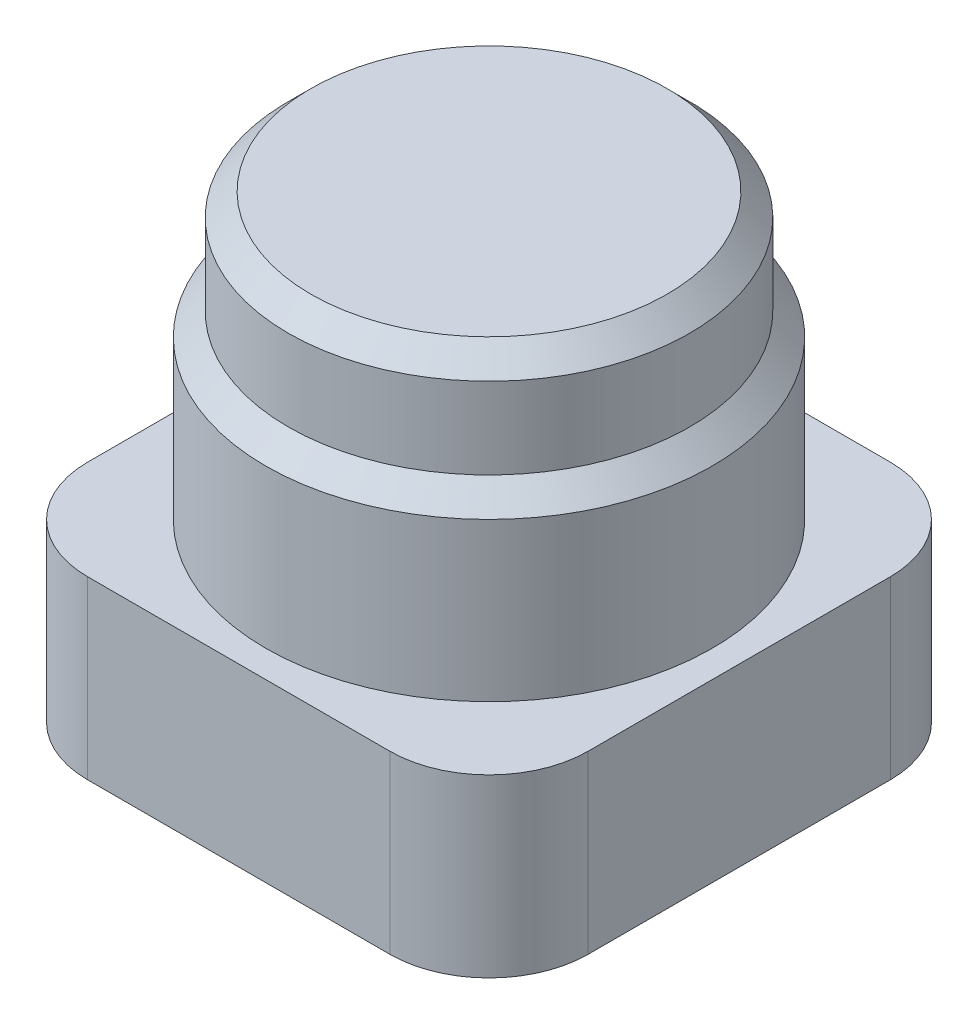
ISO-10303-21;
HEADER;
FILE_DESCRIPTION(('STEP AP214'),'2;1');
FILE_NAME('part.step','',(''),(''),'','','');
FILE_SCHEMA(('AUTOMOTIVE_DESIGN { 1 0 10303 214 1 1 1 1 }'));
ENDSEC;
DATA;
#1=APPLICATION_CONTEXT('core data for automotive mechanical design processes');
#2=APPLICATION_PROTOCOL_DEFINITION('international standard','automotive_design',2000,#1);
#3=PRODUCT_CONTEXT('',#1,'mechanical');
#4=PRODUCT('Part','Part','',(#3));
#5=PRODUCT_RELATED_PRODUCT_CATEGORY('part','',(#4));
#6=PRODUCT_DEFINITION_FORMATION('','',#4);
#7=PRODUCT_DEFINITION_CONTEXT('part definition',#1,'design');
#8=PRODUCT_DEFINITION('design','',#6,#7);
#9=PRODUCT_DEFINITION_SHAPE('','',#8);
#10=(LENGTH_UNIT() NAMED_UNIT(*) SI_UNIT(.MILLI.,.METRE.));
#11=(NAMED_UNIT(*) PLANE_ANGLE_UNIT() SI_UNIT($,.RADIAN.));
#12=(NAMED_UNIT(*) SI_UNIT($,.STERADIAN.) SOLID_ANGLE_UNIT());
#13=UNCERTAINTY_MEASURE_WITH_UNIT(LENGTH_MEASURE(1.E-05),#10,'distance_accuracy_value','');
#14=(GEOMETRIC_REPRESENTATION_CONTEXT(3) GLOBAL_UNCERTAINTY_ASSIGNED_CONTEXT((#13)) GLOBAL_UNIT_ASSIGNED_CONTEXT((#10,
#11,#12)) REPRESENTATION_CONTEXT('',''));
#15=CARTESIAN_POINT('',(0.,0.,0.));
#16=DIRECTION('',(0.,0.,1.));
#17=DIRECTION('',(1.,0.,0.));
#18=AXIS2_PLACEMENT_3D('',#15,#16,#17);
#19=CARTESIAN_POINT('',(16.75,19.5,16.75));
#20=DIRECTION('',(0.,-1.,0.));
#21=DIRECTION('',(0.,0.,-1.));
#22=AXIS2_PLACEMENT_3D('',#19,#20,#21);
#23=CYLINDRICAL_SURFACE('',#22,11.);
#24=CARTESIAN_POINT('',(16.75,0.,16.75));
#25=DIRECTION('',(0.,1.,0.));
#26=DIRECTION('',(0.,0.,1.));
#27=AXIS2_PLACEMENT_3D('',#24,#25,#26);
#28=CIRCLE('',#27,11.);
#29=CARTESIAN_POINT('',(16.75,0.,27.75));
#30=VERTEX_POINT('',#29);
#31=CARTESIAN_POINT('',(27.75,0.,16.75));
#32=VERTEX_POINT('',#31);
#33=EDGE_CURVE('E144',#30,#32,#28,.T.);
#34=ORIENTED_EDGE('',*,*,#33,.T.);
#35=DIRECTION('',(0.,-1.,0.));
#36=VECTOR('',#35,1.);
#37=CARTESIAN_POINT('',(27.75,19.5,16.75));
#38=LINE('',#37,#36);
#39=CARTESIAN_POINT('',(27.75,19.5,16.75));
#40=VERTEX_POINT('',#39);
#41=EDGE_CURVE('E172',#40,#32,#38,.T.);
#42=ORIENTED_EDGE('',*,*,#41,.F.);
#43=CARTESIAN_POINT('',(16.75,19.5,16.75));
#44=DIRECTION('',(0.,1.,0.));
#45=DIRECTION('',(0.,0.,1.));
#46=AXIS2_PLACEMENT_3D('',#43,#44,#45);
#47=CIRCLE('',#46,11.);
#48=CARTESIAN_POINT('',(16.75,19.5,27.75));
#49=VERTEX_POINT('',#48);
#50=EDGE_CURVE('E159',#49,#40,#47,.T.);
#51=ORIENTED_EDGE('',*,*,#50,.F.);
#52=DIRECTION('',(0.,-1.,0.));
#53=VECTOR('',#52,1.);
#54=CARTESIAN_POINT('',(16.75,19.5,27.75));
#55=LINE('',#54,#53);
#56=EDGE_CURVE('E140',#49,#30,#55,.T.);
#57=ORIENTED_EDGE('',*,*,#56,.T.);
#58=EDGE_LOOP('',(#34,#42,#51,#57));
#59=FACE_BOUND('',#58,.T.);
#60=ADVANCED_FACE('F45',(#59),#23,.T.);
#61=CARTESIAN_POINT('',(27.75,19.5,16.75));
#62=DIRECTION('',(-1.,0.,0.));
#63=DIRECTION('',(0.,0.,1.));
#64=AXIS2_PLACEMENT_3D('',#61,#62,#63);
#65=PLANE('',#64);
#66=DIRECTION('',(0.,0.,-1.));
#67=VECTOR('',#66,1.);
#68=CARTESIAN_POINT('',(27.75,0.,16.75));
#69=LINE('',#68,#67);
#70=CARTESIAN_POINT('',(27.75,0.,-16.75));
#71=VERTEX_POINT('',#70);
#72=EDGE_CURVE('E147',#32,#71,#69,.T.);
#73=ORIENTED_EDGE('',*,*,#72,.T.);
#74=DIRECTION('',(0.,-1.,0.));
#75=VECTOR('',#74,1.);
#76=CARTESIAN_POINT('',(27.75,19.5,-16.75));
#77=LINE('',#76,#75);
#78=CARTESIAN_POINT('',(27.75,19.5,-16.75));
#79=VERTEX_POINT('',#78);
#80=EDGE_CURVE('E169',#79,#71,#77,.T.);
#81=ORIENTED_EDGE('',*,*,#80,.F.);
#82=DIRECTION('',(0.,0.,-1.));
#83=VECTOR('',#82,1.);
#84=CARTESIAN_POINT('',(27.75,19.5,16.75));
#85=LINE('',#84,#83);
#86=EDGE_CURVE('E107',#40,#79,#85,.T.);
#87=ORIENTED_EDGE('',*,*,#86,.F.);
#88=ORIENTED_EDGE('',*,*,#41,.T.);
#89=EDGE_LOOP('',(#73,#81,#87,#88));
#90=FACE_BOUND('',#89,.T.);
#91=ADVANCED_FACE('F199',(#90),#65,.F.);
#92=CARTESIAN_POINT('',(16.75,19.5,-16.75));
#93=DIRECTION('',(0.,-1.,0.));
#94=DIRECTION('',(0.,0.,-1.));
#95=AXIS2_PLACEMENT_3D('',#92,#93,#94);
#96=CYLINDRICAL_SURFACE('',#95,11.);
#97=CARTESIAN_POINT('',(16.75,0.,-16.75));
#98=DIRECTION('',(0.,1.,0.));
#99=DIRECTION('',(0.,0.,-1.));
#100=AXIS2_PLACEMENT_3D('',#97,#98,#99);
#101=CIRCLE('',#100,11.);
#102=CARTESIAN_POINT('',(16.75,0.,-27.75));
#103=VERTEX_POINT('',#102);
#104=EDGE_CURVE('E150',#71,#103,#101,.T.);
#105=ORIENTED_EDGE('',*,*,#104,.T.);
#106=DIRECTION('',(0.,-1.,0.));
#107=VECTOR('',#106,1.);
#108=CARTESIAN_POINT('',(16.75,19.5,-27.75));
#109=LINE('',#108,#107);
#110=CARTESIAN_POINT('',(16.75,19.5,-27.75));
#111=VERTEX_POINT('',#110);
#112=EDGE_CURVE('E166',#111,#103,#109,.T.);
#113=ORIENTED_EDGE('',*,*,#112,.F.);
#114=CARTESIAN_POINT('',(16.75,19.5,-16.75));
#115=DIRECTION('',(0.,1.,0.));
#116=DIRECTION('',(0.,0.,-1.));
#117=AXIS2_PLACEMENT_3D('',#114,#115,#116);
#118=CIRCLE('',#117,11.);
#119=EDGE_CURVE('E329',#79,#111,#118,.T.);
#120=ORIENTED_EDGE('',*,*,#119,.F.);
#121=ORIENTED_EDGE('',*,*,#80,.T.);
#122=EDGE_LOOP('',(#105,#113,#120,#121));
#123=FACE_BOUND('',#122,.T.);
#124=ADVANCED_FACE('F204',(#123),#96,.T.);
#125=CARTESIAN_POINT('',(-16.75,19.5,-27.75));
#126=DIRECTION('',(0.,0.,1.));
#127=DIRECTION('',(1.,0.,0.));
#128=AXIS2_PLACEMENT_3D('',#125,#126,#127);
#129=PLANE('',#128);
#130=DIRECTION('',(-1.,0.,0.));
#131=VECTOR('',#130,1.);
#132=CARTESIAN_POINT('',(-16.75,0.,-27.75));
#133=LINE('',#132,#131);
#134=CARTESIAN_POINT('',(-16.75,0.,-27.75));
#135=VERTEX_POINT('',#134);
#136=EDGE_CURVE('E152',#103,#135,#133,.T.);
#137=ORIENTED_EDGE('',*,*,#136,.T.);
#138=DIRECTION('',(0.,-1.,0.));
#139=VECTOR('',#138,1.);
#140=CARTESIAN_POINT('',(-16.75,19.5,-27.75));
#141=LINE('',#140,#139);
#142=CARTESIAN_POINT('',(-16.75,19.5,-27.75));
#143=VERTEX_POINT('',#142);
#144=EDGE_CURVE('E163',#143,#135,#141,.T.);
#145=ORIENTED_EDGE('',*,*,#144,.F.);
#146=DIRECTION('',(-1.,0.,0.));
#147=VECTOR('',#146,1.);
#148=CARTESIAN_POINT('',(-16.75,19.5,-27.75));
#149=LINE('',#148,#147);
#150=EDGE_CURVE('E331',#111,#143,#149,.T.);
#151=ORIENTED_EDGE('',*,*,#150,.F.);
#152=ORIENTED_EDGE('',*,*,#112,.T.);
#153=EDGE_LOOP('',(#137,#145,#151,#152));
#154=FACE_BOUND('',#153,.T.);
#155=ADVANCED_FACE('F209',(#154),#129,.F.);
#156=CARTESIAN_POINT('',(-16.75,19.5,-16.75));
#157=DIRECTION('',(0.,-1.,0.));
#158=DIRECTION('',(0.,0.,-1.));
#159=AXIS2_PLACEMENT_3D('',#156,#157,#158);
#160=CYLINDRICAL_SURFACE('',#159,11.);
#161=CARTESIAN_POINT('',(-16.75,0.,-16.75));
#162=DIRECTION('',(0.,1.,0.));
#163=DIRECTION('',(0.,0.,-1.));
#164=AXIS2_PLACEMENT_3D('',#161,#162,#163);
#165=CIRCLE('',#164,11.);
#166=CARTESIAN_POINT('',(-27.75,0.,-16.75));
#167=VERTEX_POINT('',#166);
#168=EDGE_CURVE('E154',#135,#167,#165,.T.);
#169=ORIENTED_EDGE('',*,*,#168,.T.);
#170=DIRECTION('',(0.,-1.,0.));
#171=VECTOR('',#170,1.);
#172=CARTESIAN_POINT('',(-27.75,19.5,-16.75));
#173=LINE('',#172,#171);
#174=CARTESIAN_POINT('',(-27.75,19.5,-16.75));
#175=VERTEX_POINT('',#174);
#176=EDGE_CURVE('E135',#175,#167,#173,.T.);
#177=ORIENTED_EDGE('',*,*,#176,.F.);
#178=CARTESIAN_POINT('',(-16.75,19.5,-16.75));
#179=DIRECTION('',(0.,1.,0.));
#180=DIRECTION('',(0.,0.,-1.));
#181=AXIS2_PLACEMENT_3D('',#178,#179,#180);
#182=CIRCLE('',#181,11.);
#183=EDGE_CURVE('E126',#143,#175,#182,.T.);
#184=ORIENTED_EDGE('',*,*,#183,.F.);
#185=ORIENTED_EDGE('',*,*,#144,.T.);
#186=EDGE_LOOP('',(#169,#177,#184,#185));
#187=FACE_BOUND('',#186,.T.);
#188=ADVANCED_FACE('F213',(#187),#160,.T.);
#189=CARTESIAN_POINT('',(-27.75,19.5,16.75));
#190=DIRECTION('',(1.,0.,0.));
#191=DIRECTION('',(0.,0.,-1.));
#192=AXIS2_PLACEMENT_3D('',#189,#190,#191);
#193=PLANE('',#192);
#194=DIRECTION('',(0.,0.,1.));
#195=VECTOR('',#194,1.);
#196=CARTESIAN_POINT('',(-27.75,0.,16.75));
#197=LINE('',#196,#195);
#198=CARTESIAN_POINT('',(-27.75,0.,16.75));
#199=VERTEX_POINT('',#198);
#200=EDGE_CURVE('E134',#167,#199,#197,.T.);
#201=ORIENTED_EDGE('',*,*,#200,.T.);
#202=DIRECTION('',(0.,-1.,0.));
#203=VECTOR('',#202,1.);
#204=CARTESIAN_POINT('',(-27.75,19.5,16.75));
#205=LINE('',#204,#203);
#206=CARTESIAN_POINT('',(-27.75,19.5,16.75));
#207=VERTEX_POINT('',#206);
#208=EDGE_CURVE('E131',#207,#199,#205,.T.);
#209=ORIENTED_EDGE('',*,*,#208,.F.);
#210=DIRECTION('',(0.,0.,1.));
#211=VECTOR('',#210,1.);
#212=CARTESIAN_POINT('',(-27.75,19.5,16.75));
#213=LINE('',#212,#211);
#214=EDGE_CURVE('E120',#175,#207,#213,.T.);
#215=ORIENTED_EDGE('',*,*,#214,.F.);
#216=ORIENTED_EDGE('',*,*,#176,.T.);
#217=EDGE_LOOP('',(#201,#209,#215,#216));
#218=FACE_BOUND('',#217,.T.);
#219=ADVANCED_FACE('F132',(#218),#193,.F.);
#220=CARTESIAN_POINT('',(-16.75,19.5,16.75));
#221=DIRECTION('',(0.,-1.,0.));
#222=DIRECTION('',(0.,0.,-1.));
#223=AXIS2_PLACEMENT_3D('',#220,#221,#222);
#224=CYLINDRICAL_SURFACE('',#223,11.);
#225=CARTESIAN_POINT('',(-16.75,0.,16.75));
#226=DIRECTION('',(0.,1.,0.));
#227=DIRECTION('',(0.,0.,-1.));
#228=AXIS2_PLACEMENT_3D('',#225,#226,#227);
#229=CIRCLE('',#228,11.);
#230=CARTESIAN_POINT('',(-16.75,0.,27.75));
#231=VERTEX_POINT('',#230);
#232=EDGE_CURVE('E92',#199,#231,#229,.T.);
#233=ORIENTED_EDGE('',*,*,#232,.T.);
#234=DIRECTION('',(0.,-1.,0.));
#235=VECTOR('',#234,1.);
#236=CARTESIAN_POINT('',(-16.75,19.5,27.75));
#237=LINE('',#236,#235);
#238=CARTESIAN_POINT('',(-16.75,19.5,27.75));
#239=VERTEX_POINT('',#238);
#240=EDGE_CURVE('E136',#239,#231,#237,.T.);
#241=ORIENTED_EDGE('',*,*,#240,.F.);
#242=CARTESIAN_POINT('',(-16.75,19.5,16.75));
#243=DIRECTION('',(0.,1.,0.));
#244=DIRECTION('',(0.,0.,-1.));
#245=AXIS2_PLACEMENT_3D('',#242,#243,#244);
#246=CIRCLE('',#245,11.);
#247=EDGE_CURVE('E124',#207,#239,#246,.T.);
#248=ORIENTED_EDGE('',*,*,#247,.F.);
#249=ORIENTED_EDGE('',*,*,#208,.T.);
#250=EDGE_LOOP('',(#233,#241,#248,#249));
#251=FACE_BOUND('',#250,.T.);
#252=ADVANCED_FACE('F138',(#251),#224,.T.);
#253=CARTESIAN_POINT('',(-16.75,19.5,27.75));
#254=DIRECTION('',(0.,0.,-1.));
#255=DIRECTION('',(-1.,0.,0.));
#256=AXIS2_PLACEMENT_3D('',#253,#254,#255);
#257=PLANE('',#256);
#258=DIRECTION('',(1.,0.,0.));
#259=VECTOR('',#258,1.);
#260=CARTESIAN_POINT('',(-16.75,0.,27.75));
#261=LINE('',#260,#259);
#262=EDGE_CURVE('E98',#231,#30,#261,.T.);
#263=ORIENTED_EDGE('',*,*,#262,.T.);
#264=ORIENTED_EDGE('',*,*,#56,.F.);
#265=DIRECTION('',(1.,0.,0.));
#266=VECTOR('',#265,1.);
#267=CARTESIAN_POINT('',(-16.75,19.5,27.75));
#268=LINE('',#267,#266);
#269=EDGE_CURVE('E63',#239,#49,#268,.T.);
#270=ORIENTED_EDGE('',*,*,#269,.F.);
#271=ORIENTED_EDGE('',*,*,#240,.T.);
#272=EDGE_LOOP('',(#263,#264,#270,#271));
#273=FACE_BOUND('',#272,.T.);
#274=ADVANCED_FACE('F222',(#273),#257,.F.);
#275=CARTESIAN_POINT('',(16.75,19.5,16.75));
#276=DIRECTION('',(0.,1.,0.));
#277=DIRECTION('',(0.,0.,1.));
#278=AXIS2_PLACEMENT_3D('',#275,#276,#277);
#279=PLANE('',#278);
#280=CARTESIAN_POINT('',(0.,19.5,0.));
#281=DIRECTION('',(0.,1.,0.));
#282=DIRECTION('',(0.,0.,1.));
#283=AXIS2_PLACEMENT_3D('',#280,#281,#282);
#284=CIRCLE('',#283,24.75);
#285=CARTESIAN_POINT('',(0.,19.5,24.75));
#286=VERTEX_POINT('',#285);
#287=EDGE_CURVE('E174',#286,#286,#284,.T.);
#288=ORIENTED_EDGE('',*,*,#287,.F.);
#289=EDGE_LOOP('',(#288));
#290=FACE_BOUND('',#289,.T.);
#291=ORIENTED_EDGE('',*,*,#50,.T.);
#292=ORIENTED_EDGE('',*,*,#86,.T.);
#293=ORIENTED_EDGE('',*,*,#119,.T.);
#294=ORIENTED_EDGE('',*,*,#150,.T.);
#295=ORIENTED_EDGE('',*,*,#183,.T.);
#296=ORIENTED_EDGE('',*,*,#214,.T.);
#297=ORIENTED_EDGE('',*,*,#247,.T.);
#298=ORIENTED_EDGE('',*,*,#269,.T.);
#299=EDGE_LOOP('',(#291,#292,#293,#294,#295,#296,#297,#298));
#300=FACE_BOUND('',#299,.T.);
#301=ADVANCED_FACE('F122',(#290,#300),#279,.T.);
#302=CARTESIAN_POINT('',(16.75,0.,16.75));
#303=DIRECTION('',(0.,1.,0.));
#304=DIRECTION('',(0.,0.,1.));
#305=AXIS2_PLACEMENT_3D('',#302,#303,#304);
#306=PLANE('',#305);
#307=CARTESIAN_POINT('',(-21.5,0.,21.5));
#308=DIRECTION('',(0.,-1.,0.));
#309=DIRECTION('',(0.,0.,1.));
#310=AXIS2_PLACEMENT_3D('',#307,#308,#309);
#311=CIRCLE('',#310,1.25);
#312=CARTESIAN_POINT('',(-21.5,0.,22.75));
#313=VERTEX_POINT('',#312);
#314=EDGE_CURVE('E319',#313,#313,#311,.T.);
#315=ORIENTED_EDGE('',*,*,#314,.F.);
#316=EDGE_LOOP('',(#315));
#317=FACE_BOUND('',#316,.T.);
#318=CARTESIAN_POINT('',(-25.,0.,0.));
#319=DIRECTION('',(0.,-1.,0.));
#320=DIRECTION('',(0.,0.,1.));
#321=AXIS2_PLACEMENT_3D('',#318,#319,#320);
#322=CIRCLE('',#321,1.025);
#323=CARTESIAN_POINT('',(-25.,0.,1.025));
#324=VERTEX_POINT('',#323);
#325=EDGE_CURVE('E313',#324,#324,#322,.T.);
#326=ORIENTED_EDGE('',*,*,#325,.F.);
#327=EDGE_LOOP('',(#326));
#328=FACE_BOUND('',#327,.T.);
#329=CARTESIAN_POINT('',(-21.5,0.,-21.5));
#330=DIRECTION('',(0.,-1.,0.));
#331=DIRECTION('',(0.,0.,-1.));
#332=AXIS2_PLACEMENT_3D('',#329,#330,#331);
#333=CIRCLE('',#332,1.25);
#334=CARTESIAN_POINT('',(-21.5,0.,-22.75));
#335=VERTEX_POINT('',#334);
#336=EDGE_CURVE('E307',#335,#335,#333,.T.);
#337=ORIENTED_EDGE('',*,*,#336,.F.);
#338=EDGE_LOOP('',(#337));
#339=FACE_BOUND('',#338,.T.);
#340=CARTESIAN_POINT('',(21.5,0.,-21.5));
#341=DIRECTION('',(0.,-1.,0.));
#342=DIRECTION('',(0.,0.,1.));
#343=AXIS2_PLACEMENT_3D('',#340,#341,#342);
#344=CIRCLE('',#343,1.25);
#345=CARTESIAN_POINT('',(21.5,0.,-20.25));
#346=VERTEX_POINT('',#345);
#347=EDGE_CURVE('E301',#346,#346,#344,.T.);
#348=ORIENTED_EDGE('',*,*,#347,.F.);
#349=EDGE_LOOP('',(#348));
#350=FACE_BOUND('',#349,.T.);
#351=CARTESIAN_POINT('',(25.,0.,0.));
#352=DIRECTION('',(0.,-1.,0.));
#353=DIRECTION('',(0.,0.,-1.));
#354=AXIS2_PLACEMENT_3D('',#351,#352,#353);
#355=CIRCLE('',#354,1.025);
#356=CARTESIAN_POINT('',(25.,0.,-1.025));
#357=VERTEX_POINT('',#356);
#358=EDGE_CURVE('E290',#357,#357,#355,.T.);
#359=ORIENTED_EDGE('',*,*,#358,.F.);
#360=EDGE_LOOP('',(#359));
#361=FACE_BOUND('',#360,.T.);
#362=CARTESIAN_POINT('',(21.5,0.,21.5));
#363=DIRECTION('',(0.,-1.,0.));
#364=DIRECTION('',(0.,0.,-1.));
#365=AXIS2_PLACEMENT_3D('',#362,#363,#364);
#366=CIRCLE('',#365,1.25);
#367=CARTESIAN_POINT('',(21.5,0.,20.25));
#368=VERTEX_POINT('',#367);
#369=EDGE_CURVE('E289',#368,#368,#366,.T.);
#370=ORIENTED_EDGE('',*,*,#369,.F.);
#371=EDGE_LOOP('',(#370));
#372=FACE_BOUND('',#371,.T.);
#373=ORIENTED_EDGE('',*,*,#33,.F.);
#374=ORIENTED_EDGE('',*,*,#262,.F.);
#375=ORIENTED_EDGE('',*,*,#232,.F.);
#376=ORIENTED_EDGE('',*,*,#200,.F.);
#377=ORIENTED_EDGE('',*,*,#168,.F.);
#378=ORIENTED_EDGE('',*,*,#136,.F.);
#379=ORIENTED_EDGE('',*,*,#104,.F.);
#380=ORIENTED_EDGE('',*,*,#72,.F.);
#381=EDGE_LOOP('',(#373,#374,#375,#376,#377,#378,#379,#380));
#382=FACE_BOUND('',#381,.T.);
#383=ADVANCED_FACE('F225',(#317,#328,#339,#350,#361,#372,#382),#306,.F.);
#384=CARTESIAN_POINT('',(0.,37.,0.));
#385=DIRECTION('',(0.,-1.,0.));
#386=DIRECTION('',(0.,0.,-1.));
#387=AXIS2_PLACEMENT_3D('',#384,#385,#386);
#388=CYLINDRICAL_SURFACE('',#387,24.75);
#389=CARTESIAN_POINT('',(0.,37.,0.));
#390=DIRECTION('',(0.,1.,0.));
#391=DIRECTION('',(0.,0.,1.));
#392=AXIS2_PLACEMENT_3D('',#389,#390,#391);
#393=CIRCLE('',#392,24.75);
#394=CARTESIAN_POINT('',(0.,37.,24.75));
#395=VERTEX_POINT('',#394);
#396=EDGE_CURVE('E148',#395,#395,#393,.T.);
#397=ORIENTED_EDGE('',*,*,#396,.F.);
#398=EDGE_LOOP('',(#397));
#399=FACE_BOUND('',#398,.T.);
#400=ORIENTED_EDGE('',*,*,#287,.T.);
#401=EDGE_LOOP('',(#400));
#402=FACE_BOUND('',#401,.T.);
#403=ADVANCED_FACE('F228',(#399,#402),#388,.T.);
#404=CARTESIAN_POINT('',(0.,51.,0.));
#405=DIRECTION('',(0.,-1.,0.));
#406=DIRECTION('',(0.,0.,-1.));
#407=AXIS2_PLACEMENT_3D('',#404,#405,#406);
#408=CYLINDRICAL_SURFACE('',#407,22.25);
#409=CARTESIAN_POINT('',(0.,39.5,0.));
#410=DIRECTION('',(0.,1.,0.));
#411=DIRECTION('',(0.,0.,1.));
#412=AXIS2_PLACEMENT_3D('',#409,#410,#411);
#413=CIRCLE('',#412,22.25);
#414=CARTESIAN_POINT('',(0.,39.5,22.25));
#415=VERTEX_POINT('',#414);
#416=EDGE_CURVE('E55',#415,#415,#413,.T.);
#417=ORIENTED_EDGE('',*,*,#416,.T.);
#418=EDGE_LOOP('',(#417));
#419=FACE_BOUND('',#418,.T.);
#420=CARTESIAN_POINT('',(0.,48.5,0.));
#421=DIRECTION('',(0.,1.,0.));
#422=DIRECTION('',(0.,0.,1.));
#423=AXIS2_PLACEMENT_3D('',#420,#421,#422);
#424=CIRCLE('',#423,22.25);
#425=CARTESIAN_POINT('',(0.,48.5,22.25));
#426=VERTEX_POINT('',#425);
#427=EDGE_CURVE('E175',#426,#426,#424,.F.);
#428=ORIENTED_EDGE('',*,*,#427,.T.);
#429=EDGE_LOOP('',(#428));
#430=FACE_BOUND('',#429,.T.);
#431=ADVANCED_FACE('F180',(#419,#430),#408,.T.);
#432=CARTESIAN_POINT('',(0.,51.,0.));
#433=DIRECTION('',(0.,1.,0.));
#434=DIRECTION('',(0.,0.,1.));
#435=AXIS2_PLACEMENT_3D('',#432,#433,#434);
#436=PLANE('',#435);
#437=CARTESIAN_POINT('',(0.,51.,0.));
#438=DIRECTION('',(0.,1.,0.));
#439=DIRECTION('',(0.,0.,1.));
#440=AXIS2_PLACEMENT_3D('',#437,#438,#439);
#441=CIRCLE('',#440,19.75);
#442=CARTESIAN_POINT('',(0.,51.,19.75));
#443=VERTEX_POINT('',#442);
#444=EDGE_CURVE('E13',#443,#443,#441,.T.);
#445=ORIENTED_EDGE('',*,*,#444,.T.);
#446=EDGE_LOOP('',(#445));
#447=FACE_BOUND('',#446,.T.);
#448=ADVANCED_FACE('F185',(#447),#436,.T.);
#449=CARTESIAN_POINT('',(0.,39.5,0.));
#450=DIRECTION('',(0.,-1.,0.));
#451=DIRECTION('',(0.,0.,-1.));
#452=AXIS2_PLACEMENT_3D('',#449,#450,#451);
#453=CONICAL_SURFACE('',#452,22.25,0.785398163397448);
#454=ORIENTED_EDGE('',*,*,#396,.T.);
#455=EDGE_LOOP('',(#454));
#456=FACE_BOUND('',#455,.T.);
#457=ORIENTED_EDGE('',*,*,#416,.F.);
#458=EDGE_LOOP('',(#457));
#459=FACE_BOUND('',#458,.T.);
#460=ADVANCED_FACE('F183',(#456,#459),#453,.T.);
#461=CARTESIAN_POINT('',(0.,51.,0.));
#462=DIRECTION('',(0.,-1.,0.));
#463=DIRECTION('',(0.,0.,-1.));
#464=AXIS2_PLACEMENT_3D('',#461,#462,#463);
#465=CONICAL_SURFACE('',#464,19.75,0.785398163397448);
#466=ORIENTED_EDGE('',*,*,#427,.F.);
#467=EDGE_LOOP('',(#466));
#468=FACE_BOUND('',#467,.T.);
#469=ORIENTED_EDGE('',*,*,#444,.F.);
#470=EDGE_LOOP('',(#469));
#471=FACE_BOUND('',#470,.T.);
#472=ADVANCED_FACE('F48',(#468,#471),#465,.T.);
#473=CARTESIAN_POINT('',(21.5,6.,21.5));
#474=DIRECTION('',(0.,-1.,0.));
#475=DIRECTION('',(0.,0.,-1.));
#476=AXIS2_PLACEMENT_3D('',#473,#474,#475);
#477=CYLINDRICAL_SURFACE('',#476,1.25);
#478=CARTESIAN_POINT('',(21.5,6.,21.5));
#479=DIRECTION('',(0.,-1.,0.));
#480=DIRECTION('',(0.,0.,-1.));
#481=AXIS2_PLACEMENT_3D('',#478,#479,#480);
#482=CIRCLE('',#481,1.25);
#483=CARTESIAN_POINT('',(21.5,6.,20.25));
#484=VERTEX_POINT('',#483);
#485=EDGE_CURVE('E293',#484,#484,#482,.T.);
#486=ORIENTED_EDGE('',*,*,#485,.F.);
#487=EDGE_LOOP('',(#486));
#488=FACE_BOUND('',#487,.T.);
#489=ORIENTED_EDGE('',*,*,#369,.T.);
#490=EDGE_LOOP('',(#489));
#491=FACE_BOUND('',#490,.T.);
#492=ADVANCED_FACE('F191',(#488,#491),#477,.F.);
#493=CARTESIAN_POINT('',(21.5,6.,21.5));
#494=DIRECTION('',(0.,-1.,0.));
#495=DIRECTION('',(0.,0.,-1.));
#496=AXIS2_PLACEMENT_3D('',#493,#494,#495);
#497=PLANE('',#496);
#498=ORIENTED_EDGE('',*,*,#485,.T.);
#499=EDGE_LOOP('',(#498));
#500=FACE_BOUND('',#499,.T.);
#501=ADVANCED_FACE('F240',(#500),#497,.T.);
#502=CARTESIAN_POINT('',(25.,6.,0.));
#503=DIRECTION('',(0.,-1.,0.));
#504=DIRECTION('',(0.,0.,-1.));
#505=AXIS2_PLACEMENT_3D('',#502,#503,#504);
#506=CYLINDRICAL_SURFACE('',#505,1.025);
#507=CARTESIAN_POINT('',(25.,6.,0.));
#508=DIRECTION('',(0.,-1.,0.));
#509=DIRECTION('',(0.,0.,-1.));
#510=AXIS2_PLACEMENT_3D('',#507,#508,#509);
#511=CIRCLE('',#510,1.025);
#512=CARTESIAN_POINT('',(25.,6.,-1.025));
#513=VERTEX_POINT('',#512);
#514=EDGE_CURVE('E288',#513,#513,#511,.T.);
#515=ORIENTED_EDGE('',*,*,#514,.F.);
#516=EDGE_LOOP('',(#515));
#517=FACE_BOUND('',#516,.T.);
#518=ORIENTED_EDGE('',*,*,#358,.T.);
#519=EDGE_LOOP('',(#518));
#520=FACE_BOUND('',#519,.T.);
#521=ADVANCED_FACE('F244',(#517,#520),#506,.F.);
#522=CARTESIAN_POINT('',(25.,6.,0.));
#523=DIRECTION('',(0.,-1.,0.));
#524=DIRECTION('',(0.,0.,-1.));
#525=AXIS2_PLACEMENT_3D('',#522,#523,#524);
#526=PLANE('',#525);
#527=ORIENTED_EDGE('',*,*,#514,.T.);
#528=EDGE_LOOP('',(#527));
#529=FACE_BOUND('',#528,.T.);
#530=ADVANCED_FACE('F274',(#529),#526,.T.);
#531=CARTESIAN_POINT('',(21.5,6.,-21.5));
#532=DIRECTION('',(0.,-1.,0.));
#533=DIRECTION('',(0.,0.,-1.));
#534=AXIS2_PLACEMENT_3D('',#531,#532,#533);
#535=CYLINDRICAL_SURFACE('',#534,1.25);
#536=CARTESIAN_POINT('',(21.5,6.,-21.5));
#537=DIRECTION('',(0.,-1.,0.));
#538=DIRECTION('',(0.,0.,1.));
#539=AXIS2_PLACEMENT_3D('',#536,#537,#538);
#540=CIRCLE('',#539,1.25);
#541=CARTESIAN_POINT('',(21.5,6.,-20.25));
#542=VERTEX_POINT('',#541);
#543=EDGE_CURVE('E296',#542,#542,#540,.T.);
#544=ORIENTED_EDGE('',*,*,#543,.F.);
#545=EDGE_LOOP('',(#544));
#546=FACE_BOUND('',#545,.T.);
#547=ORIENTED_EDGE('',*,*,#347,.T.);
#548=EDGE_LOOP('',(#547));
#549=FACE_BOUND('',#548,.T.);
#550=ADVANCED_FACE('F271',(#546,#549),#535,.F.);
#551=CARTESIAN_POINT('',(21.5,6.,-21.5));
#552=DIRECTION('',(0.,1.,0.));
#553=DIRECTION('',(0.,0.,1.));
#554=AXIS2_PLACEMENT_3D('',#551,#552,#553);
#555=PLANE('',#554);
#556=ORIENTED_EDGE('',*,*,#543,.T.);
#557=EDGE_LOOP('',(#556));
#558=FACE_BOUND('',#557,.T.);
#559=ADVANCED_FACE('F266',(#558),#555,.F.);
#560=CARTESIAN_POINT('',(-21.5,6.,-21.5));
#561=DIRECTION('',(0.,-1.,0.));
#562=DIRECTION('',(0.,0.,-1.));
#563=AXIS2_PLACEMENT_3D('',#560,#561,#562);
#564=CYLINDRICAL_SURFACE('',#563,1.25);
#565=CARTESIAN_POINT('',(-21.5,6.,-21.5));
#566=DIRECTION('',(0.,-1.,0.));
#567=DIRECTION('',(0.,0.,-1.));
#568=AXIS2_PLACEMENT_3D('',#565,#566,#567);
#569=CIRCLE('',#568,1.25);
#570=CARTESIAN_POINT('',(-21.5,6.,-22.75));
#571=VERTEX_POINT('',#570);
#572=EDGE_CURVE('E304',#571,#571,#569,.T.);
#573=ORIENTED_EDGE('',*,*,#572,.F.);
#574=EDGE_LOOP('',(#573));
#575=FACE_BOUND('',#574,.T.);
#576=ORIENTED_EDGE('',*,*,#336,.T.);
#577=EDGE_LOOP('',(#576));
#578=FACE_BOUND('',#577,.T.);
#579=ADVANCED_FACE('F263',(#575,#578),#564,.F.);
#580=CARTESIAN_POINT('',(-21.5,6.,-21.5));
#581=DIRECTION('',(0.,-1.,0.));
#582=DIRECTION('',(0.,0.,-1.));
#583=AXIS2_PLACEMENT_3D('',#580,#581,#582);
#584=PLANE('',#583);
#585=ORIENTED_EDGE('',*,*,#572,.T.);
#586=EDGE_LOOP('',(#585));
#587=FACE_BOUND('',#586,.T.);
#588=ADVANCED_FACE('F258',(#587),#584,.T.);
#589=CARTESIAN_POINT('',(-25.,6.,0.));
#590=DIRECTION('',(0.,-1.,0.));
#591=DIRECTION('',(0.,0.,-1.));
#592=AXIS2_PLACEMENT_3D('',#589,#590,#591);
#593=CYLINDRICAL_SURFACE('',#592,1.025);
#594=CARTESIAN_POINT('',(-25.,6.,0.));
#595=DIRECTION('',(0.,-1.,0.));
#596=DIRECTION('',(0.,0.,1.));
#597=AXIS2_PLACEMENT_3D('',#594,#595,#596);
#598=CIRCLE('',#597,1.025);
#599=CARTESIAN_POINT('',(-25.,6.,1.025));
#600=VERTEX_POINT('',#599);
#601=EDGE_CURVE('E310',#600,#600,#598,.T.);
#602=ORIENTED_EDGE('',*,*,#601,.F.);
#603=EDGE_LOOP('',(#602));
#604=FACE_BOUND('',#603,.T.);
#605=ORIENTED_EDGE('',*,*,#325,.T.);
#606=EDGE_LOOP('',(#605));
#607=FACE_BOUND('',#606,.T.);
#608=ADVANCED_FACE('F255',(#604,#607),#593,.F.);
#609=CARTESIAN_POINT('',(-25.,6.,0.));
#610=DIRECTION('',(0.,1.,0.));
#611=DIRECTION('',(0.,0.,1.));
#612=AXIS2_PLACEMENT_3D('',#609,#610,#611);
#613=PLANE('',#612);
#614=ORIENTED_EDGE('',*,*,#601,.T.);
#615=EDGE_LOOP('',(#614));
#616=FACE_BOUND('',#615,.T.);
#617=ADVANCED_FACE('F250',(#616),#613,.F.);
#618=CARTESIAN_POINT('',(-21.5,6.,21.5));
#619=DIRECTION('',(0.,-1.,0.));
#620=DIRECTION('',(0.,0.,-1.));
#621=AXIS2_PLACEMENT_3D('',#618,#619,#620);
#622=CYLINDRICAL_SURFACE('',#621,1.25);
#623=CARTESIAN_POINT('',(-21.5,6.,21.5));
#624=DIRECTION('',(0.,-1.,0.));
#625=DIRECTION('',(0.,0.,1.));
#626=AXIS2_PLACEMENT_3D('',#623,#624,#625);
#627=CIRCLE('',#626,1.25);
#628=CARTESIAN_POINT('',(-21.5,6.,22.75));
#629=VERTEX_POINT('',#628);
#630=EDGE_CURVE('E316',#629,#629,#627,.T.);
#631=ORIENTED_EDGE('',*,*,#630,.F.);
#632=EDGE_LOOP('',(#631));
#633=FACE_BOUND('',#632,.T.);
#634=ORIENTED_EDGE('',*,*,#314,.T.);
#635=EDGE_LOOP('',(#634));
#636=FACE_BOUND('',#635,.T.);
#637=ADVANCED_FACE('F246',(#633,#636),#622,.F.);
#638=CARTESIAN_POINT('',(-21.5,6.,21.5));
#639=DIRECTION('',(0.,1.,0.));
#640=DIRECTION('',(0.,0.,1.));
#641=AXIS2_PLACEMENT_3D('',#638,#639,#640);
#642=PLANE('',#641);
#643=ORIENTED_EDGE('',*,*,#630,.T.);
#644=EDGE_LOOP('',(#643));
#645=FACE_BOUND('',#644,.T.);
#646=ADVANCED_FACE('F249',(#645),#642,.F.);
#647=CLOSED_SHELL('',(#60,#91,#124,#155,#188,#219,#252,#274,#301,#383,#403,#431,#448,#460,#472,
#492,#501,#521,#530,#550,#559,#579,#588,#608,#617,#637,#646));
#648=MANIFOLD_SOLID_BREP('B2',#647);
#649=ADVANCED_BREP_SHAPE_REPRESENTATION('',(#18,#648),#14);
#650=SHAPE_DEFINITION_REPRESENTATION(#9,#649);
ENDSEC;
END-ISO-10303-21;
